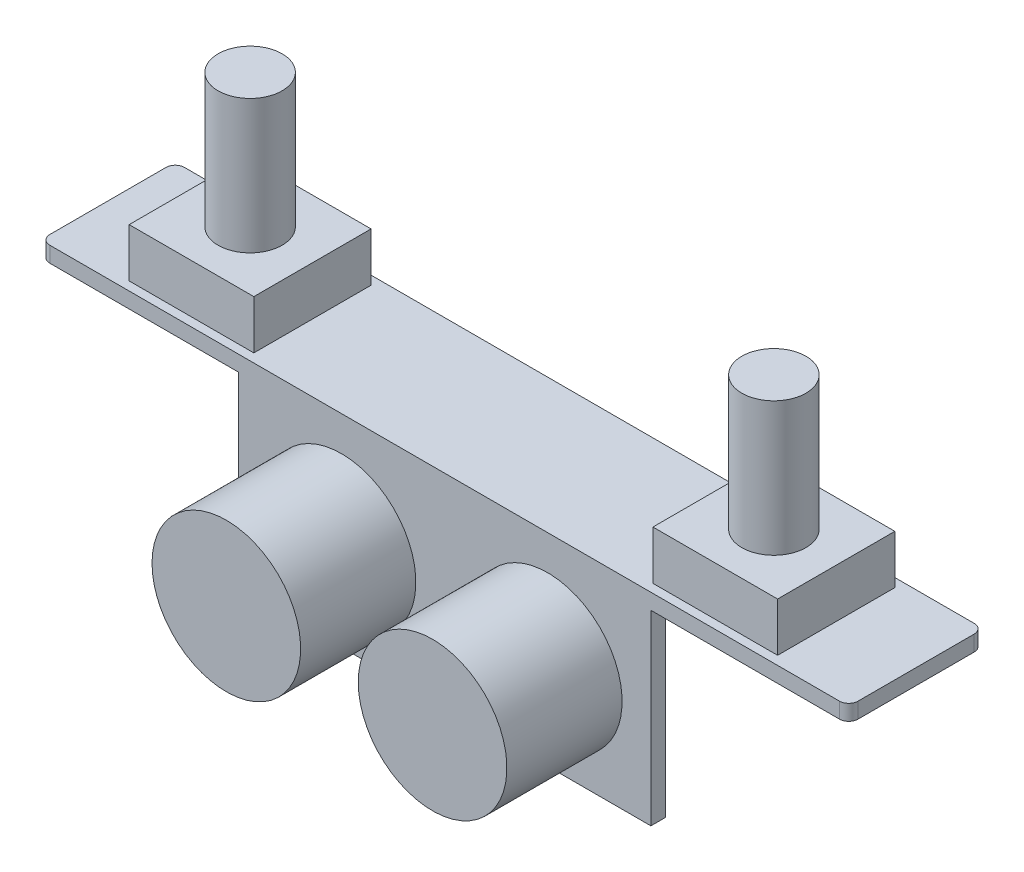
ISO-10303-21;
HEADER;
FILE_DESCRIPTION(('STEP AP214'),'2;1');
FILE_NAME('part.step','',(''),(''),'','','');
FILE_SCHEMA(('AUTOMOTIVE_DESIGN { 1 0 10303 214 1 1 1 1 }'));
ENDSEC;
DATA;
#1=APPLICATION_CONTEXT('core data for automotive mechanical design processes');
#2=APPLICATION_PROTOCOL_DEFINITION('international standard','automotive_design',2000,#1);
#3=PRODUCT_CONTEXT('',#1,'mechanical');
#4=PRODUCT('Part','Part','',(#3));
#5=PRODUCT_RELATED_PRODUCT_CATEGORY('part','',(#4));
#6=PRODUCT_DEFINITION_FORMATION('','',#4);
#7=PRODUCT_DEFINITION_CONTEXT('part definition',#1,'design');
#8=PRODUCT_DEFINITION('design','',#6,#7);
#9=PRODUCT_DEFINITION_SHAPE('','',#8);
#10=(LENGTH_UNIT() NAMED_UNIT(*) SI_UNIT(.MILLI.,.METRE.));
#11=(NAMED_UNIT(*) PLANE_ANGLE_UNIT() SI_UNIT($,.RADIAN.));
#12=(NAMED_UNIT(*) SI_UNIT($,.STERADIAN.) SOLID_ANGLE_UNIT());
#13=UNCERTAINTY_MEASURE_WITH_UNIT(LENGTH_MEASURE(1.E-05),#10,'distance_accuracy_value','');
#14=(GEOMETRIC_REPRESENTATION_CONTEXT(3) GLOBAL_UNCERTAINTY_ASSIGNED_CONTEXT((#13)) GLOBAL_UNIT_ASSIGNED_CONTEXT((#10,
#11,#12)) REPRESENTATION_CONTEXT('',''));
#15=CARTESIAN_POINT('',(0.,0.,0.));
#16=DIRECTION('',(0.,0.,1.));
#17=DIRECTION('',(1.,0.,0.));
#18=AXIS2_PLACEMENT_3D('',#15,#16,#17);
#19=CARTESIAN_POINT('',(42.5,1.68,-6.25));
#20=DIRECTION('',(0.,-1.,0.));
#21=DIRECTION('',(0.,0.,-1.));
#22=AXIS2_PLACEMENT_3D('',#19,#20,#21);
#23=PLANE('',#22);
#24=DIRECTION('',(0.,0.,1.));
#25=VECTOR('',#24,1.);
#26=CARTESIAN_POINT('',(-34.9,1.68,-6.31));
#27=LINE('',#26,#25);
#28=CARTESIAN_POINT('',(-34.9,1.68,-6.31));
#29=VERTEX_POINT('',#28);
#30=CARTESIAN_POINT('',(-34.9,1.68,6.31));
#31=VERTEX_POINT('',#30);
#32=EDGE_CURVE('E284',#29,#31,#27,.T.);
#33=ORIENTED_EDGE('',*,*,#32,.F.);
#34=DIRECTION('',(-1.,0.,0.));
#35=VECTOR('',#34,1.);
#36=CARTESIAN_POINT('',(-34.9,1.68,-6.31));
#37=LINE('',#36,#35);
#38=CARTESIAN_POINT('',(-21.48,1.68,-6.31));
#39=VERTEX_POINT('',#38);
#40=EDGE_CURVE('E290',#39,#29,#37,.T.);
#41=ORIENTED_EDGE('',*,*,#40,.F.);
#42=DIRECTION('',(0.,0.,-1.));
#43=VECTOR('',#42,1.);
#44=CARTESIAN_POINT('',(-21.48,1.68,-6.31));
#45=LINE('',#44,#43);
#46=CARTESIAN_POINT('',(-21.48,1.68,6.31));
#47=VERTEX_POINT('',#46);
#48=EDGE_CURVE('E307',#47,#39,#45,.T.);
#49=ORIENTED_EDGE('',*,*,#48,.F.);
#50=DIRECTION('',(1.,0.,0.));
#51=VECTOR('',#50,1.);
#52=CARTESIAN_POINT('',(-34.9,1.68,6.31));
#53=LINE('',#52,#51);
#54=EDGE_CURVE('E303',#31,#47,#53,.T.);
#55=ORIENTED_EDGE('',*,*,#54,.F.);
#56=EDGE_LOOP('',(#33,#41,#49,#55));
#57=FACE_BOUND('',#56,.T.);
#58=CARTESIAN_POINT('',(42.5,1.68,-6.25));
#59=DIRECTION('',(0.,1.,0.));
#60=DIRECTION('',(0.,0.,-1.));
#61=AXIS2_PLACEMENT_3D('',#58,#59,#60);
#62=CIRCLE('',#61,1.00000000000001);
#63=CARTESIAN_POINT('',(43.5,1.68,-6.25));
#64=VERTEX_POINT('',#63);
#65=CARTESIAN_POINT('',(42.5,1.68,-7.25));
#66=VERTEX_POINT('',#65);
#67=EDGE_CURVE('E330',#64,#66,#62,.T.);
#68=ORIENTED_EDGE('',*,*,#67,.T.);
#69=DIRECTION('',(-1.,0.,0.));
#70=VECTOR('',#69,1.);
#71=CARTESIAN_POINT('',(-42.5,1.68,-7.25));
#72=LINE('',#71,#70);
#73=CARTESIAN_POINT('',(-42.5,1.68,-7.25));
#74=VERTEX_POINT('',#73);
#75=EDGE_CURVE('E334',#66,#74,#72,.T.);
#76=ORIENTED_EDGE('',*,*,#75,.T.);
#77=CARTESIAN_POINT('',(-42.5,1.68,-6.25));
#78=DIRECTION('',(0.,1.,0.));
#79=DIRECTION('',(0.,0.,1.));
#80=AXIS2_PLACEMENT_3D('',#77,#78,#79);
#81=CIRCLE('',#80,1.00000000000001);
#82=CARTESIAN_POINT('',(-43.5,1.68,-6.25));
#83=VERTEX_POINT('',#82);
#84=EDGE_CURVE('E338',#74,#83,#81,.T.);
#85=ORIENTED_EDGE('',*,*,#84,.T.);
#86=DIRECTION('',(0.,0.,1.));
#87=VECTOR('',#86,1.);
#88=CARTESIAN_POINT('',(-43.5,1.68,-6.25));
#89=LINE('',#88,#87);
#90=CARTESIAN_POINT('',(-43.5,1.68,6.25));
#91=VERTEX_POINT('',#90);
#92=EDGE_CURVE('E341',#83,#91,#89,.T.);
#93=ORIENTED_EDGE('',*,*,#92,.T.);
#94=CARTESIAN_POINT('',(-42.5,1.68,6.25));
#95=DIRECTION('',(0.,1.,0.));
#96=DIRECTION('',(0.,0.,1.));
#97=AXIS2_PLACEMENT_3D('',#94,#95,#96);
#98=CIRCLE('',#97,1.00000000000001);
#99=CARTESIAN_POINT('',(-42.5,1.68,7.25000000000001));
#100=VERTEX_POINT('',#99);
#101=EDGE_CURVE('E344',#91,#100,#98,.T.);
#102=ORIENTED_EDGE('',*,*,#101,.T.);
#103=DIRECTION('',(1.,0.,0.));
#104=VECTOR('',#103,1.);
#105=CARTESIAN_POINT('',(-42.5,1.68,7.25));
#106=LINE('',#105,#104);
#107=CARTESIAN_POINT('',(42.5,1.68,7.25));
#108=VERTEX_POINT('',#107);
#109=EDGE_CURVE('E347',#100,#108,#106,.T.);
#110=ORIENTED_EDGE('',*,*,#109,.T.);
#111=CARTESIAN_POINT('',(42.5,1.68,6.25));
#112=DIRECTION('',(0.,1.,0.));
#113=DIRECTION('',(0.,0.,1.));
#114=AXIS2_PLACEMENT_3D('',#111,#112,#113);
#115=CIRCLE('',#114,1.00000000000001);
#116=CARTESIAN_POINT('',(43.5,1.68,6.25));
#117=VERTEX_POINT('',#116);
#118=EDGE_CURVE('E350',#108,#117,#115,.T.);
#119=ORIENTED_EDGE('',*,*,#118,.T.);
#120=DIRECTION('',(0.,0.,-1.));
#121=VECTOR('',#120,1.);
#122=CARTESIAN_POINT('',(43.5,1.68,-6.25));
#123=LINE('',#122,#121);
#124=EDGE_CURVE('E353',#117,#64,#123,.T.);
#125=ORIENTED_EDGE('',*,*,#124,.T.);
#126=EDGE_LOOP('',(#68,#76,#85,#93,#102,#110,#119,#125));
#127=FACE_BOUND('',#126,.T.);
#128=DIRECTION('',(0.,0.,-1.));
#129=VECTOR('',#128,1.);
#130=CARTESIAN_POINT('',(34.9,1.68,-6.31));
#131=LINE('',#130,#129);
#132=CARTESIAN_POINT('',(34.9,1.68,6.31));
#133=VERTEX_POINT('',#132);
#134=CARTESIAN_POINT('',(34.9,1.68,-6.31));
#135=VERTEX_POINT('',#134);
#136=EDGE_CURVE('E238',#133,#135,#131,.T.);
#137=ORIENTED_EDGE('',*,*,#136,.F.);
#138=DIRECTION('',(1.,0.,0.));
#139=VECTOR('',#138,1.);
#140=CARTESIAN_POINT('',(34.9,1.68,6.31));
#141=LINE('',#140,#139);
#142=CARTESIAN_POINT('',(21.48,1.68,6.31));
#143=VERTEX_POINT('',#142);
#144=EDGE_CURVE('E248',#143,#133,#141,.T.);
#145=ORIENTED_EDGE('',*,*,#144,.F.);
#146=DIRECTION('',(0.,0.,1.));
#147=VECTOR('',#146,1.);
#148=CARTESIAN_POINT('',(21.48,1.68,-6.31));
#149=LINE('',#148,#147);
#150=CARTESIAN_POINT('',(21.48,1.68,-6.31));
#151=VERTEX_POINT('',#150);
#152=EDGE_CURVE('E263',#151,#143,#149,.T.);
#153=ORIENTED_EDGE('',*,*,#152,.F.);
#154=DIRECTION('',(-1.,0.,0.));
#155=VECTOR('',#154,1.);
#156=CARTESIAN_POINT('',(34.9,1.68,-6.31));
#157=LINE('',#156,#155);
#158=EDGE_CURVE('E63',#135,#151,#157,.T.);
#159=ORIENTED_EDGE('',*,*,#158,.F.);
#160=EDGE_LOOP('',(#137,#145,#153,#159));
#161=FACE_BOUND('',#160,.T.);
#162=ADVANCED_FACE('F39',(#57,#127,#161),#23,.F.);
#163=CARTESIAN_POINT('',(42.5,1.68,-6.25));
#164=DIRECTION('',(0.,-1.,0.));
#165=DIRECTION('',(0.,0.,-1.));
#166=AXIS2_PLACEMENT_3D('',#163,#164,#165);
#167=CYLINDRICAL_SURFACE('',#166,1.00000000000001);
#168=CARTESIAN_POINT('',(42.5,0.,-6.25));
#169=DIRECTION('',(0.,1.,0.));
#170=DIRECTION('',(0.,0.,-1.));
#171=AXIS2_PLACEMENT_3D('',#168,#169,#170);
#172=CIRCLE('',#171,1.00000000000001);
#173=CARTESIAN_POINT('',(43.5,0.,-6.25));
#174=VERTEX_POINT('',#173);
#175=CARTESIAN_POINT('',(42.5,0.,-7.25));
#176=VERTEX_POINT('',#175);
#177=EDGE_CURVE('E329',#174,#176,#172,.T.);
#178=ORIENTED_EDGE('',*,*,#177,.T.);
#179=DIRECTION('',(0.,-1.,0.));
#180=VECTOR('',#179,1.);
#181=CARTESIAN_POINT('',(42.5,1.68,-7.25));
#182=LINE('',#181,#180);
#183=EDGE_CURVE('E242',#66,#176,#182,.T.);
#184=ORIENTED_EDGE('',*,*,#183,.F.);
#185=ORIENTED_EDGE('',*,*,#67,.F.);
#186=DIRECTION('',(0.,-1.,0.));
#187=VECTOR('',#186,1.);
#188=CARTESIAN_POINT('',(43.5,1.68,-6.25));
#189=LINE('',#188,#187);
#190=EDGE_CURVE('E356',#64,#174,#189,.T.);
#191=ORIENTED_EDGE('',*,*,#190,.T.);
#192=EDGE_LOOP('',(#178,#184,#185,#191));
#193=FACE_BOUND('',#192,.T.);
#194=ADVANCED_FACE('F41',(#193),#167,.T.);
#195=CARTESIAN_POINT('',(-42.5,1.68,-7.25));
#196=DIRECTION('',(0.,0.,1.));
#197=DIRECTION('',(1.,0.,0.));
#198=AXIS2_PLACEMENT_3D('',#195,#196,#197);
#199=PLANE('',#198);
#200=DIRECTION('',(-1.,0.,0.));
#201=VECTOR('',#200,1.);
#202=CARTESIAN_POINT('',(-42.5,0.,-7.25));
#203=LINE('',#202,#201);
#204=CARTESIAN_POINT('',(-42.5,0.,-7.25));
#205=VERTEX_POINT('',#204);
#206=EDGE_CURVE('E360',#176,#205,#203,.T.);
#207=ORIENTED_EDGE('',*,*,#206,.T.);
#208=DIRECTION('',(0.,-1.,0.));
#209=VECTOR('',#208,1.);
#210=CARTESIAN_POINT('',(-42.5,1.68,-7.25));
#211=LINE('',#210,#209);
#212=EDGE_CURVE('E405',#74,#205,#211,.T.);
#213=ORIENTED_EDGE('',*,*,#212,.F.);
#214=ORIENTED_EDGE('',*,*,#75,.F.);
#215=ORIENTED_EDGE('',*,*,#183,.T.);
#216=EDGE_LOOP('',(#207,#213,#214,#215));
#217=FACE_BOUND('',#216,.T.);
#218=ADVANCED_FACE('F465',(#217),#199,.F.);
#219=CARTESIAN_POINT('',(-42.5,1.68,-6.25));
#220=DIRECTION('',(0.,-1.,0.));
#221=DIRECTION('',(0.,0.,-1.));
#222=AXIS2_PLACEMENT_3D('',#219,#220,#221);
#223=CYLINDRICAL_SURFACE('',#222,1.00000000000001);
#224=CARTESIAN_POINT('',(-42.5,0.,-6.25));
#225=DIRECTION('',(0.,1.,0.));
#226=DIRECTION('',(0.,0.,1.));
#227=AXIS2_PLACEMENT_3D('',#224,#225,#226);
#228=CIRCLE('',#227,1.00000000000001);
#229=CARTESIAN_POINT('',(-43.5,0.,-6.25));
#230=VERTEX_POINT('',#229);
#231=EDGE_CURVE('E363',#205,#230,#228,.T.);
#232=ORIENTED_EDGE('',*,*,#231,.T.);
#233=DIRECTION('',(0.,-1.,0.));
#234=VECTOR('',#233,1.);
#235=CARTESIAN_POINT('',(-43.5,1.68,-6.25));
#236=LINE('',#235,#234);
#237=EDGE_CURVE('E401',#83,#230,#236,.T.);
#238=ORIENTED_EDGE('',*,*,#237,.F.);
#239=ORIENTED_EDGE('',*,*,#84,.F.);
#240=ORIENTED_EDGE('',*,*,#212,.T.);
#241=EDGE_LOOP('',(#232,#238,#239,#240));
#242=FACE_BOUND('',#241,.T.);
#243=ADVANCED_FACE('F462',(#242),#223,.T.);
#244=CARTESIAN_POINT('',(-43.5,1.68,-6.25));
#245=DIRECTION('',(1.,0.,0.));
#246=DIRECTION('',(0.,0.,-1.));
#247=AXIS2_PLACEMENT_3D('',#244,#245,#246);
#248=PLANE('',#247);
#249=DIRECTION('',(0.,0.,1.));
#250=VECTOR('',#249,1.);
#251=CARTESIAN_POINT('',(-43.5,0.,-6.25));
#252=LINE('',#251,#250);
#253=CARTESIAN_POINT('',(-43.5,0.,6.25));
#254=VERTEX_POINT('',#253);
#255=EDGE_CURVE('E366',#230,#254,#252,.T.);
#256=ORIENTED_EDGE('',*,*,#255,.T.);
#257=DIRECTION('',(0.,-1.,0.));
#258=VECTOR('',#257,1.);
#259=CARTESIAN_POINT('',(-43.5,1.68,6.25));
#260=LINE('',#259,#258);
#261=EDGE_CURVE('E397',#91,#254,#260,.T.);
#262=ORIENTED_EDGE('',*,*,#261,.F.);
#263=ORIENTED_EDGE('',*,*,#92,.F.);
#264=ORIENTED_EDGE('',*,*,#237,.T.);
#265=EDGE_LOOP('',(#256,#262,#263,#264));
#266=FACE_BOUND('',#265,.T.);
#267=ADVANCED_FACE('F458',(#266),#248,.F.);
#268=CARTESIAN_POINT('',(-42.5,1.68,6.25));
#269=DIRECTION('',(0.,-1.,0.));
#270=DIRECTION('',(0.,0.,-1.));
#271=AXIS2_PLACEMENT_3D('',#268,#269,#270);
#272=CYLINDRICAL_SURFACE('',#271,1.00000000000001);
#273=CARTESIAN_POINT('',(-42.5,0.,6.25));
#274=DIRECTION('',(0.,1.,0.));
#275=DIRECTION('',(0.,0.,1.));
#276=AXIS2_PLACEMENT_3D('',#273,#274,#275);
#277=CIRCLE('',#276,1.00000000000001);
#278=CARTESIAN_POINT('',(-42.5,0.,7.25000000000001));
#279=VERTEX_POINT('',#278);
#280=EDGE_CURVE('E369',#254,#279,#277,.T.);
#281=ORIENTED_EDGE('',*,*,#280,.T.);
#282=DIRECTION('',(0.,-1.,0.));
#283=VECTOR('',#282,1.);
#284=CARTESIAN_POINT('',(-42.5,1.68,7.25000000000001));
#285=LINE('',#284,#283);
#286=EDGE_CURVE('E393',#100,#279,#285,.T.);
#287=ORIENTED_EDGE('',*,*,#286,.F.);
#288=ORIENTED_EDGE('',*,*,#101,.F.);
#289=ORIENTED_EDGE('',*,*,#261,.T.);
#290=EDGE_LOOP('',(#281,#287,#288,#289));
#291=FACE_BOUND('',#290,.T.);
#292=ADVANCED_FACE('F421',(#291),#272,.T.);
#293=CARTESIAN_POINT('',(-42.5,1.68,7.25));
#294=DIRECTION('',(0.,0.,-1.));
#295=DIRECTION('',(-1.,0.,0.));
#296=AXIS2_PLACEMENT_3D('',#293,#294,#295);
#297=PLANE('',#296);
#298=CARTESIAN_POINT('',(-11.1,-10.05,7.25));
#299=DIRECTION('',(0.,0.,-1.));
#300=DIRECTION('',(-1.,0.,0.));
#301=AXIS2_PLACEMENT_3D('',#298,#299,#300);
#302=CIRCLE('',#301,8.);
#303=CARTESIAN_POINT('',(-19.1,-10.05,7.25));
#304=VERTEX_POINT('',#303);
#305=EDGE_CURVE('E11',#304,#304,#302,.F.);
#306=ORIENTED_EDGE('',*,*,#305,.F.);
#307=EDGE_LOOP('',(#306));
#308=FACE_BOUND('',#307,.T.);
#309=CARTESIAN_POINT('',(11.1,-10.05,7.25));
#310=DIRECTION('',(0.,0.,-1.));
#311=DIRECTION('',(-1.,0.,0.));
#312=AXIS2_PLACEMENT_3D('',#309,#310,#311);
#313=CIRCLE('',#312,8.);
#314=CARTESIAN_POINT('',(3.1,-10.05,7.25));
#315=VERTEX_POINT('',#314);
#316=EDGE_CURVE('E48',#315,#315,#313,.F.);
#317=ORIENTED_EDGE('',*,*,#316,.F.);
#318=EDGE_LOOP('',(#317));
#319=FACE_BOUND('',#318,.T.);
#320=DIRECTION('',(1.,0.,0.));
#321=VECTOR('',#320,1.);
#322=CARTESIAN_POINT('',(-42.5,0.,7.25));
#323=LINE('',#322,#321);
#324=CARTESIAN_POINT('',(-22.2,0.,7.25));
#325=VERTEX_POINT('',#324);
#326=EDGE_CURVE('E373',#279,#325,#323,.T.);
#327=ORIENTED_EDGE('',*,*,#326,.T.);
#328=DIRECTION('',(0.,-1.,0.));
#329=VECTOR('',#328,1.);
#330=CARTESIAN_POINT('',(-22.2,0.,7.25));
#331=LINE('',#330,#329);
#332=CARTESIAN_POINT('',(-22.2,-20.1,7.25));
#333=VERTEX_POINT('',#332);
#334=EDGE_CURVE('E55',#325,#333,#331,.T.);
#335=ORIENTED_EDGE('',*,*,#334,.T.);
#336=DIRECTION('',(1.,0.,0.));
#337=VECTOR('',#336,1.);
#338=CARTESIAN_POINT('',(-22.2,-20.1,7.25));
#339=LINE('',#338,#337);
#340=CARTESIAN_POINT('',(22.2,-20.1,7.25));
#341=VERTEX_POINT('',#340);
#342=EDGE_CURVE('E182',#333,#341,#339,.T.);
#343=ORIENTED_EDGE('',*,*,#342,.T.);
#344=DIRECTION('',(0.,1.,0.));
#345=VECTOR('',#344,1.);
#346=CARTESIAN_POINT('',(22.2,0.,7.25));
#347=LINE('',#346,#345);
#348=CARTESIAN_POINT('',(22.2,0.,7.25));
#349=VERTEX_POINT('',#348);
#350=EDGE_CURVE('E201',#341,#349,#347,.T.);
#351=ORIENTED_EDGE('',*,*,#350,.T.);
#352=CARTESIAN_POINT('',(42.5,0.,7.25));
#353=VERTEX_POINT('',#352);
#354=EDGE_CURVE('E372',#349,#353,#323,.T.);
#355=ORIENTED_EDGE('',*,*,#354,.T.);
#356=DIRECTION('',(0.,-1.,0.));
#357=VECTOR('',#356,1.);
#358=CARTESIAN_POINT('',(42.5,1.68,7.25));
#359=LINE('',#358,#357);
#360=EDGE_CURVE('E389',#108,#353,#359,.T.);
#361=ORIENTED_EDGE('',*,*,#360,.F.);
#362=ORIENTED_EDGE('',*,*,#109,.F.);
#363=ORIENTED_EDGE('',*,*,#286,.T.);
#364=EDGE_LOOP('',(#327,#335,#343,#351,#355,#361,#362,#363));
#365=FACE_BOUND('',#364,.T.);
#366=ADVANCED_FACE('F417',(#308,#319,#365),#297,.F.);
#367=CARTESIAN_POINT('',(42.5,1.68,6.25));
#368=DIRECTION('',(0.,-1.,0.));
#369=DIRECTION('',(0.,0.,-1.));
#370=AXIS2_PLACEMENT_3D('',#367,#368,#369);
#371=CYLINDRICAL_SURFACE('',#370,1.00000000000001);
#372=CARTESIAN_POINT('',(42.5,0.,6.25));
#373=DIRECTION('',(0.,1.,0.));
#374=DIRECTION('',(0.,0.,1.));
#375=AXIS2_PLACEMENT_3D('',#372,#373,#374);
#376=CIRCLE('',#375,1.00000000000001);
#377=CARTESIAN_POINT('',(43.5,0.,6.25));
#378=VERTEX_POINT('',#377);
#379=EDGE_CURVE('E377',#353,#378,#376,.T.);
#380=ORIENTED_EDGE('',*,*,#379,.T.);
#381=DIRECTION('',(0.,-1.,0.));
#382=VECTOR('',#381,1.);
#383=CARTESIAN_POINT('',(43.5,1.68,6.25));
#384=LINE('',#383,#382);
#385=EDGE_CURVE('E385',#117,#378,#384,.T.);
#386=ORIENTED_EDGE('',*,*,#385,.F.);
#387=ORIENTED_EDGE('',*,*,#118,.F.);
#388=ORIENTED_EDGE('',*,*,#360,.T.);
#389=EDGE_LOOP('',(#380,#386,#387,#388));
#390=FACE_BOUND('',#389,.T.);
#391=ADVANCED_FACE('F420',(#390),#371,.T.);
#392=CARTESIAN_POINT('',(43.5,1.68,-6.25));
#393=DIRECTION('',(-1.,0.,0.));
#394=DIRECTION('',(0.,0.,1.));
#395=AXIS2_PLACEMENT_3D('',#392,#393,#394);
#396=PLANE('',#395);
#397=DIRECTION('',(0.,0.,-1.));
#398=VECTOR('',#397,1.);
#399=CARTESIAN_POINT('',(43.5,0.,-6.25));
#400=LINE('',#399,#398);
#401=EDGE_CURVE('E335',#378,#174,#400,.T.);
#402=ORIENTED_EDGE('',*,*,#401,.T.);
#403=ORIENTED_EDGE('',*,*,#190,.F.);
#404=ORIENTED_EDGE('',*,*,#124,.F.);
#405=ORIENTED_EDGE('',*,*,#385,.T.);
#406=EDGE_LOOP('',(#402,#403,#404,#405));
#407=FACE_BOUND('',#406,.T.);
#408=ADVANCED_FACE('F446',(#407),#396,.F.);
#409=CARTESIAN_POINT('',(42.5,0.,-6.25));
#410=DIRECTION('',(0.,-1.,0.));
#411=DIRECTION('',(0.,0.,-1.));
#412=AXIS2_PLACEMENT_3D('',#409,#410,#411);
#413=PLANE('',#412);
#414=DIRECTION('',(0.,0.,1.));
#415=VECTOR('',#414,1.);
#416=CARTESIAN_POINT('',(22.2,0.,5.65));
#417=LINE('',#416,#415);
#418=CARTESIAN_POINT('',(22.2,0.,5.65));
#419=VERTEX_POINT('',#418);
#420=EDGE_CURVE('E221',#419,#349,#417,.T.);
#421=ORIENTED_EDGE('',*,*,#420,.F.);
#422=DIRECTION('',(-1.,0.,0.));
#423=VECTOR('',#422,1.);
#424=CARTESIAN_POINT('',(-22.2,0.,5.65));
#425=LINE('',#424,#423);
#426=CARTESIAN_POINT('',(-22.2,0.,5.65));
#427=VERTEX_POINT('',#426);
#428=EDGE_CURVE('E186',#419,#427,#425,.T.);
#429=ORIENTED_EDGE('',*,*,#428,.T.);
#430=DIRECTION('',(0.,0.,1.));
#431=VECTOR('',#430,1.);
#432=CARTESIAN_POINT('',(-22.2,0.,5.65));
#433=LINE('',#432,#431);
#434=EDGE_CURVE('E199',#427,#325,#433,.T.);
#435=ORIENTED_EDGE('',*,*,#434,.T.);
#436=ORIENTED_EDGE('',*,*,#326,.F.);
#437=ORIENTED_EDGE('',*,*,#280,.F.);
#438=ORIENTED_EDGE('',*,*,#255,.F.);
#439=ORIENTED_EDGE('',*,*,#231,.F.);
#440=ORIENTED_EDGE('',*,*,#206,.F.);
#441=ORIENTED_EDGE('',*,*,#177,.F.);
#442=ORIENTED_EDGE('',*,*,#401,.F.);
#443=ORIENTED_EDGE('',*,*,#379,.F.);
#444=ORIENTED_EDGE('',*,*,#354,.F.);
#445=EDGE_LOOP('',(#421,#429,#435,#436,#437,#438,#439,#440,#441,#442,#443,#444));
#446=FACE_BOUND('',#445,.T.);
#447=ADVANCED_FACE('F430',(#446),#413,.T.);
#448=CARTESIAN_POINT('',(-34.9,6.93,-6.31));
#449=DIRECTION('',(1.,0.,0.));
#450=DIRECTION('',(0.,0.,-1.));
#451=AXIS2_PLACEMENT_3D('',#448,#449,#450);
#452=PLANE('',#451);
#453=ORIENTED_EDGE('',*,*,#32,.T.);
#454=DIRECTION('',(0.,-1.,0.));
#455=VECTOR('',#454,1.);
#456=CARTESIAN_POINT('',(-34.9,6.93,6.31));
#457=LINE('',#456,#455);
#458=CARTESIAN_POINT('',(-34.9,6.93,6.31));
#459=VERTEX_POINT('',#458);
#460=EDGE_CURVE('E325',#459,#31,#457,.T.);
#461=ORIENTED_EDGE('',*,*,#460,.F.);
#462=DIRECTION('',(0.,0.,1.));
#463=VECTOR('',#462,1.);
#464=CARTESIAN_POINT('',(-34.9,6.93,-6.31));
#465=LINE('',#464,#463);
#466=CARTESIAN_POINT('',(-34.9,6.93,-6.31));
#467=VERTEX_POINT('',#466);
#468=EDGE_CURVE('E285',#467,#459,#465,.T.);
#469=ORIENTED_EDGE('',*,*,#468,.F.);
#470=DIRECTION('',(0.,-1.,0.));
#471=VECTOR('',#470,1.);
#472=CARTESIAN_POINT('',(-34.9,6.93,-6.31));
#473=LINE('',#472,#471);
#474=EDGE_CURVE('E299',#467,#29,#473,.T.);
#475=ORIENTED_EDGE('',*,*,#474,.T.);
#476=EDGE_LOOP('',(#453,#461,#469,#475));
#477=FACE_BOUND('',#476,.T.);
#478=ADVANCED_FACE('F479',(#477),#452,.F.);
#479=CARTESIAN_POINT('',(-34.9,6.93,6.31));
#480=DIRECTION('',(0.,0.,-1.));
#481=DIRECTION('',(-1.,0.,0.));
#482=AXIS2_PLACEMENT_3D('',#479,#480,#481);
#483=PLANE('',#482);
#484=ORIENTED_EDGE('',*,*,#54,.T.);
#485=DIRECTION('',(0.,-1.,0.));
#486=VECTOR('',#485,1.);
#487=CARTESIAN_POINT('',(-21.48,6.93,6.31));
#488=LINE('',#487,#486);
#489=CARTESIAN_POINT('',(-21.48,6.93,6.31));
#490=VERTEX_POINT('',#489);
#491=EDGE_CURVE('E321',#490,#47,#488,.T.);
#492=ORIENTED_EDGE('',*,*,#491,.F.);
#493=DIRECTION('',(1.,0.,0.));
#494=VECTOR('',#493,1.);
#495=CARTESIAN_POINT('',(-34.9,6.93,6.31));
#496=LINE('',#495,#494);
#497=EDGE_CURVE('E289',#459,#490,#496,.T.);
#498=ORIENTED_EDGE('',*,*,#497,.F.);
#499=ORIENTED_EDGE('',*,*,#460,.T.);
#500=EDGE_LOOP('',(#484,#492,#498,#499));
#501=FACE_BOUND('',#500,.T.);
#502=ADVANCED_FACE('F524',(#501),#483,.F.);
#503=CARTESIAN_POINT('',(-21.48,6.93,-6.31));
#504=DIRECTION('',(-1.,0.,0.));
#505=DIRECTION('',(0.,0.,1.));
#506=AXIS2_PLACEMENT_3D('',#503,#504,#505);
#507=PLANE('',#506);
#508=ORIENTED_EDGE('',*,*,#48,.T.);
#509=DIRECTION('',(0.,-1.,0.));
#510=VECTOR('',#509,1.);
#511=CARTESIAN_POINT('',(-21.48,6.93,-6.31));
#512=LINE('',#511,#510);
#513=CARTESIAN_POINT('',(-21.48,6.93,-6.31));
#514=VERTEX_POINT('',#513);
#515=EDGE_CURVE('E317',#514,#39,#512,.T.);
#516=ORIENTED_EDGE('',*,*,#515,.F.);
#517=DIRECTION('',(0.,0.,-1.));
#518=VECTOR('',#517,1.);
#519=CARTESIAN_POINT('',(-21.48,6.93,-6.31));
#520=LINE('',#519,#518);
#521=EDGE_CURVE('E293',#490,#514,#520,.T.);
#522=ORIENTED_EDGE('',*,*,#521,.F.);
#523=ORIENTED_EDGE('',*,*,#491,.T.);
#524=EDGE_LOOP('',(#508,#516,#522,#523));
#525=FACE_BOUND('',#524,.T.);
#526=ADVANCED_FACE('F531',(#525),#507,.F.);
#527=CARTESIAN_POINT('',(-34.9,6.93,-6.31));
#528=DIRECTION('',(0.,0.,1.));
#529=DIRECTION('',(1.,0.,0.));
#530=AXIS2_PLACEMENT_3D('',#527,#528,#529);
#531=PLANE('',#530);
#532=ORIENTED_EDGE('',*,*,#40,.T.);
#533=ORIENTED_EDGE('',*,*,#474,.F.);
#534=DIRECTION('',(-1.,0.,0.));
#535=VECTOR('',#534,1.);
#536=CARTESIAN_POINT('',(-34.9,6.93,-6.31));
#537=LINE('',#536,#535);
#538=EDGE_CURVE('E296',#514,#467,#537,.T.);
#539=ORIENTED_EDGE('',*,*,#538,.F.);
#540=ORIENTED_EDGE('',*,*,#515,.T.);
#541=EDGE_LOOP('',(#532,#533,#539,#540));
#542=FACE_BOUND('',#541,.T.);
#543=ADVANCED_FACE('F538',(#542),#531,.F.);
#544=CARTESIAN_POINT('',(0.,6.93,0.));
#545=DIRECTION('',(0.,1.,0.));
#546=DIRECTION('',(0.,0.,1.));
#547=AXIS2_PLACEMENT_3D('',#544,#545,#546);
#548=PLANE('',#547);
#549=CARTESIAN_POINT('',(-28.19,6.93,0.));
#550=DIRECTION('',(0.,1.,0.));
#551=DIRECTION('',(0.,0.,1.));
#552=AXIS2_PLACEMENT_3D('',#549,#550,#551);
#553=CIRCLE('',#552,3.45);
#554=CARTESIAN_POINT('',(-28.19,6.93,3.45));
#555=VERTEX_POINT('',#554);
#556=EDGE_CURVE('E234',#555,#555,#553,.T.);
#557=ORIENTED_EDGE('',*,*,#556,.F.);
#558=EDGE_LOOP('',(#557));
#559=FACE_BOUND('',#558,.T.);
#560=ORIENTED_EDGE('',*,*,#468,.T.);
#561=ORIENTED_EDGE('',*,*,#497,.T.);
#562=ORIENTED_EDGE('',*,*,#521,.T.);
#563=ORIENTED_EDGE('',*,*,#538,.T.);
#564=EDGE_LOOP('',(#560,#561,#562,#563));
#565=FACE_BOUND('',#564,.T.);
#566=ADVANCED_FACE('F546',(#559,#565),#548,.T.);
#567=CARTESIAN_POINT('',(34.9,6.93,-6.31));
#568=DIRECTION('',(-1.,0.,0.));
#569=DIRECTION('',(0.,0.,1.));
#570=AXIS2_PLACEMENT_3D('',#567,#568,#569);
#571=PLANE('',#570);
#572=ORIENTED_EDGE('',*,*,#136,.T.);
#573=DIRECTION('',(0.,-1.,0.));
#574=VECTOR('',#573,1.);
#575=CARTESIAN_POINT('',(34.9,6.93,-6.31));
#576=LINE('',#575,#574);
#577=CARTESIAN_POINT('',(34.9,6.93,-6.31));
#578=VERTEX_POINT('',#577);
#579=EDGE_CURVE('E281',#578,#135,#576,.T.);
#580=ORIENTED_EDGE('',*,*,#579,.F.);
#581=DIRECTION('',(0.,0.,-1.));
#582=VECTOR('',#581,1.);
#583=CARTESIAN_POINT('',(34.9,6.93,-6.31));
#584=LINE('',#583,#582);
#585=CARTESIAN_POINT('',(34.9,6.93,6.31));
#586=VERTEX_POINT('',#585);
#587=EDGE_CURVE('E243',#586,#578,#584,.T.);
#588=ORIENTED_EDGE('',*,*,#587,.F.);
#589=DIRECTION('',(0.,-1.,0.));
#590=VECTOR('',#589,1.);
#591=CARTESIAN_POINT('',(34.9,6.93,6.31));
#592=LINE('',#591,#590);
#593=EDGE_CURVE('E257',#586,#133,#592,.T.);
#594=ORIENTED_EDGE('',*,*,#593,.T.);
#595=EDGE_LOOP('',(#572,#580,#588,#594));
#596=FACE_BOUND('',#595,.T.);
#597=ADVANCED_FACE('F555',(#596),#571,.F.);
#598=CARTESIAN_POINT('',(34.9,6.93,-6.31));
#599=DIRECTION('',(0.,0.,1.));
#600=DIRECTION('',(1.,0.,0.));
#601=AXIS2_PLACEMENT_3D('',#598,#599,#600);
#602=PLANE('',#601);
#603=ORIENTED_EDGE('',*,*,#158,.T.);
#604=DIRECTION('',(0.,-1.,0.));
#605=VECTOR('',#604,1.);
#606=CARTESIAN_POINT('',(21.48,6.93,-6.31));
#607=LINE('',#606,#605);
#608=CARTESIAN_POINT('',(21.48,6.93,-6.31));
#609=VERTEX_POINT('',#608);
#610=EDGE_CURVE('E277',#609,#151,#607,.T.);
#611=ORIENTED_EDGE('',*,*,#610,.F.);
#612=DIRECTION('',(-1.,0.,0.));
#613=VECTOR('',#612,1.);
#614=CARTESIAN_POINT('',(34.9,6.93,-6.31));
#615=LINE('',#614,#613);
#616=EDGE_CURVE('E247',#578,#609,#615,.T.);
#617=ORIENTED_EDGE('',*,*,#616,.F.);
#618=ORIENTED_EDGE('',*,*,#579,.T.);
#619=EDGE_LOOP('',(#603,#611,#617,#618));
#620=FACE_BOUND('',#619,.T.);
#621=ADVANCED_FACE('F564',(#620),#602,.F.);
#622=CARTESIAN_POINT('',(21.48,6.93,-6.31));
#623=DIRECTION('',(1.,0.,0.));
#624=DIRECTION('',(0.,0.,-1.));
#625=AXIS2_PLACEMENT_3D('',#622,#623,#624);
#626=PLANE('',#625);
#627=ORIENTED_EDGE('',*,*,#152,.T.);
#628=DIRECTION('',(0.,-1.,0.));
#629=VECTOR('',#628,1.);
#630=CARTESIAN_POINT('',(21.48,6.93,6.31));
#631=LINE('',#630,#629);
#632=CARTESIAN_POINT('',(21.48,6.93,6.31));
#633=VERTEX_POINT('',#632);
#634=EDGE_CURVE('E273',#633,#143,#631,.T.);
#635=ORIENTED_EDGE('',*,*,#634,.F.);
#636=DIRECTION('',(0.,0.,1.));
#637=VECTOR('',#636,1.);
#638=CARTESIAN_POINT('',(21.48,6.93,-6.31));
#639=LINE('',#638,#637);
#640=EDGE_CURVE('E251',#609,#633,#639,.T.);
#641=ORIENTED_EDGE('',*,*,#640,.F.);
#642=ORIENTED_EDGE('',*,*,#610,.T.);
#643=EDGE_LOOP('',(#627,#635,#641,#642));
#644=FACE_BOUND('',#643,.T.);
#645=ADVANCED_FACE('F572',(#644),#626,.F.);
#646=CARTESIAN_POINT('',(34.9,6.93,6.31));
#647=DIRECTION('',(0.,0.,-1.));
#648=DIRECTION('',(-1.,0.,0.));
#649=AXIS2_PLACEMENT_3D('',#646,#647,#648);
#650=PLANE('',#649);
#651=ORIENTED_EDGE('',*,*,#144,.T.);
#652=ORIENTED_EDGE('',*,*,#593,.F.);
#653=DIRECTION('',(1.,0.,0.));
#654=VECTOR('',#653,1.);
#655=CARTESIAN_POINT('',(34.9,6.93,6.31));
#656=LINE('',#655,#654);
#657=EDGE_CURVE('E254',#633,#586,#656,.T.);
#658=ORIENTED_EDGE('',*,*,#657,.F.);
#659=ORIENTED_EDGE('',*,*,#634,.T.);
#660=EDGE_LOOP('',(#651,#652,#658,#659));
#661=FACE_BOUND('',#660,.T.);
#662=ADVANCED_FACE('F580',(#661),#650,.F.);
#663=CARTESIAN_POINT('',(0.,6.93,0.));
#664=DIRECTION('',(0.,-1.,0.));
#665=DIRECTION('',(0.,0.,-1.));
#666=AXIS2_PLACEMENT_3D('',#663,#664,#665);
#667=PLANE('',#666);
#668=CARTESIAN_POINT('',(28.19,6.93,0.));
#669=DIRECTION('',(0.,1.,0.));
#670=DIRECTION('',(0.,0.,-1.));
#671=AXIS2_PLACEMENT_3D('',#668,#669,#670);
#672=CIRCLE('',#671,3.45);
#673=CARTESIAN_POINT('',(28.19,6.93,-3.45));
#674=VERTEX_POINT('',#673);
#675=EDGE_CURVE('E230',#674,#674,#672,.T.);
#676=ORIENTED_EDGE('',*,*,#675,.F.);
#677=EDGE_LOOP('',(#676));
#678=FACE_BOUND('',#677,.T.);
#679=ORIENTED_EDGE('',*,*,#587,.T.);
#680=ORIENTED_EDGE('',*,*,#616,.T.);
#681=ORIENTED_EDGE('',*,*,#640,.T.);
#682=ORIENTED_EDGE('',*,*,#657,.T.);
#683=EDGE_LOOP('',(#679,#680,#681,#682));
#684=FACE_BOUND('',#683,.T.);
#685=ADVANCED_FACE('F587',(#678,#684),#667,.F.);
#686=CARTESIAN_POINT('',(-28.19,21.33,0.));
#687=DIRECTION('',(0.,-1.,0.));
#688=DIRECTION('',(0.,0.,-1.));
#689=AXIS2_PLACEMENT_3D('',#686,#687,#688);
#690=CYLINDRICAL_SURFACE('',#689,3.45);
#691=CARTESIAN_POINT('',(-28.19,21.33,0.));
#692=DIRECTION('',(0.,1.,0.));
#693=DIRECTION('',(0.,0.,1.));
#694=AXIS2_PLACEMENT_3D('',#691,#692,#693);
#695=CIRCLE('',#694,3.45);
#696=CARTESIAN_POINT('',(-28.19,21.33,3.45));
#697=VERTEX_POINT('',#696);
#698=EDGE_CURVE('E229',#697,#697,#695,.T.);
#699=ORIENTED_EDGE('',*,*,#698,.F.);
#700=EDGE_LOOP('',(#699));
#701=FACE_BOUND('',#700,.T.);
#702=ORIENTED_EDGE('',*,*,#556,.T.);
#703=EDGE_LOOP('',(#702));
#704=FACE_BOUND('',#703,.T.);
#705=ADVANCED_FACE('F594',(#701,#704),#690,.T.);
#706=CARTESIAN_POINT('',(-28.19,21.33,0.));
#707=DIRECTION('',(0.,1.,0.));
#708=DIRECTION('',(0.,0.,1.));
#709=AXIS2_PLACEMENT_3D('',#706,#707,#708);
#710=PLANE('',#709);
#711=ORIENTED_EDGE('',*,*,#698,.T.);
#712=EDGE_LOOP('',(#711));
#713=FACE_BOUND('',#712,.T.);
#714=ADVANCED_FACE('F602',(#713),#710,.T.);
#715=CARTESIAN_POINT('',(28.19,21.33,0.));
#716=DIRECTION('',(0.,-1.,0.));
#717=DIRECTION('',(0.,0.,-1.));
#718=AXIS2_PLACEMENT_3D('',#715,#716,#717);
#719=CYLINDRICAL_SURFACE('',#718,3.45);
#720=CARTESIAN_POINT('',(28.19,21.33,0.));
#721=DIRECTION('',(0.,1.,0.));
#722=DIRECTION('',(0.,0.,-1.));
#723=AXIS2_PLACEMENT_3D('',#720,#721,#722);
#724=CIRCLE('',#723,3.45);
#725=CARTESIAN_POINT('',(28.19,21.33,-3.45));
#726=VERTEX_POINT('',#725);
#727=EDGE_CURVE('E220',#726,#726,#724,.T.);
#728=ORIENTED_EDGE('',*,*,#727,.F.);
#729=EDGE_LOOP('',(#728));
#730=FACE_BOUND('',#729,.T.);
#731=ORIENTED_EDGE('',*,*,#675,.T.);
#732=EDGE_LOOP('',(#731));
#733=FACE_BOUND('',#732,.T.);
#734=ADVANCED_FACE('F610',(#730,#733),#719,.T.);
#735=CARTESIAN_POINT('',(28.19,21.33,0.));
#736=DIRECTION('',(0.,-1.,0.));
#737=DIRECTION('',(0.,0.,-1.));
#738=AXIS2_PLACEMENT_3D('',#735,#736,#737);
#739=PLANE('',#738);
#740=ORIENTED_EDGE('',*,*,#727,.T.);
#741=EDGE_LOOP('',(#740));
#742=FACE_BOUND('',#741,.T.);
#743=ADVANCED_FACE('F618',(#742),#739,.F.);
#744=CARTESIAN_POINT('',(-22.2,0.,5.65));
#745=DIRECTION('',(-1.,0.,0.));
#746=DIRECTION('',(0.,-1.,0.));
#747=AXIS2_PLACEMENT_3D('',#744,#745,#746);
#748=PLANE('',#747);
#749=ORIENTED_EDGE('',*,*,#334,.F.);
#750=ORIENTED_EDGE('',*,*,#434,.F.);
#751=DIRECTION('',(0.,-1.,0.));
#752=VECTOR('',#751,1.);
#753=CARTESIAN_POINT('',(-22.2,0.,5.65));
#754=LINE('',#753,#752);
#755=CARTESIAN_POINT('',(-22.2,-20.1,5.65));
#756=VERTEX_POINT('',#755);
#757=EDGE_CURVE('E193',#427,#756,#754,.T.);
#758=ORIENTED_EDGE('',*,*,#757,.T.);
#759=DIRECTION('',(0.,0.,1.));
#760=VECTOR('',#759,1.);
#761=CARTESIAN_POINT('',(-22.2,-20.1,5.65));
#762=LINE('',#761,#760);
#763=EDGE_CURVE('E177',#756,#333,#762,.T.);
#764=ORIENTED_EDGE('',*,*,#763,.T.);
#765=EDGE_LOOP('',(#749,#750,#758,#764));
#766=FACE_BOUND('',#765,.T.);
#767=ADVANCED_FACE('F198',(#766),#748,.T.);
#768=CARTESIAN_POINT('',(22.2,0.,5.65));
#769=DIRECTION('',(1.,0.,0.));
#770=DIRECTION('',(0.,1.,0.));
#771=AXIS2_PLACEMENT_3D('',#768,#769,#770);
#772=PLANE('',#771);
#773=ORIENTED_EDGE('',*,*,#350,.F.);
#774=DIRECTION('',(0.,0.,1.));
#775=VECTOR('',#774,1.);
#776=CARTESIAN_POINT('',(22.2,-20.1,5.65));
#777=LINE('',#776,#775);
#778=CARTESIAN_POINT('',(22.2,-20.1,5.65));
#779=VERTEX_POINT('',#778);
#780=EDGE_CURVE('E185',#779,#341,#777,.T.);
#781=ORIENTED_EDGE('',*,*,#780,.F.);
#782=DIRECTION('',(0.,1.,0.));
#783=VECTOR('',#782,1.);
#784=CARTESIAN_POINT('',(22.2,0.,5.65));
#785=LINE('',#784,#783);
#786=EDGE_CURVE('E195',#779,#419,#785,.T.);
#787=ORIENTED_EDGE('',*,*,#786,.T.);
#788=ORIENTED_EDGE('',*,*,#420,.T.);
#789=EDGE_LOOP('',(#773,#781,#787,#788));
#790=FACE_BOUND('',#789,.T.);
#791=ADVANCED_FACE('F436',(#790),#772,.T.);
#792=CARTESIAN_POINT('',(-22.2,-20.1,5.65));
#793=DIRECTION('',(0.,-1.,0.));
#794=DIRECTION('',(0.,0.,-1.));
#795=AXIS2_PLACEMENT_3D('',#792,#793,#794);
#796=PLANE('',#795);
#797=ORIENTED_EDGE('',*,*,#342,.F.);
#798=ORIENTED_EDGE('',*,*,#763,.F.);
#799=DIRECTION('',(1.,0.,0.));
#800=VECTOR('',#799,1.);
#801=CARTESIAN_POINT('',(-22.2,-20.1,5.65));
#802=LINE('',#801,#800);
#803=EDGE_CURVE('E180',#756,#779,#802,.T.);
#804=ORIENTED_EDGE('',*,*,#803,.T.);
#805=ORIENTED_EDGE('',*,*,#780,.T.);
#806=EDGE_LOOP('',(#797,#798,#804,#805));
#807=FACE_BOUND('',#806,.T.);
#808=ADVANCED_FACE('F179',(#807),#796,.T.);
#809=CARTESIAN_POINT('',(0.,0.,5.65));
#810=DIRECTION('',(0.,0.,1.));
#811=DIRECTION('',(1.,0.,0.));
#812=AXIS2_PLACEMENT_3D('',#809,#810,#811);
#813=PLANE('',#812);
#814=ORIENTED_EDGE('',*,*,#757,.F.);
#815=ORIENTED_EDGE('',*,*,#428,.F.);
#816=ORIENTED_EDGE('',*,*,#786,.F.);
#817=ORIENTED_EDGE('',*,*,#803,.F.);
#818=EDGE_LOOP('',(#814,#815,#816,#817));
#819=FACE_BOUND('',#818,.T.);
#820=ADVANCED_FACE('F191',(#819),#813,.F.);
#821=CARTESIAN_POINT('',(11.1,-10.05,19.65));
#822=DIRECTION('',(0.,0.,-1.));
#823=DIRECTION('',(-1.,0.,0.));
#824=AXIS2_PLACEMENT_3D('',#821,#822,#823);
#825=CYLINDRICAL_SURFACE('',#824,8.);
#826=CARTESIAN_POINT('',(11.1,-10.05,19.65));
#827=DIRECTION('',(0.,0.,1.));
#828=DIRECTION('',(1.,0.,0.));
#829=AXIS2_PLACEMENT_3D('',#826,#827,#828);
#830=CIRCLE('',#829,8.);
#831=CARTESIAN_POINT('',(3.1,-10.05,19.65));
#832=VERTEX_POINT('',#831);
#833=EDGE_CURVE('E207',#832,#832,#830,.T.);
#834=CARTESIAN_POINT('',(3.1,-10.05,19.65));
#835=CARTESIAN_POINT('',(3.1,-10.05,19.5208333333333));
#836=CARTESIAN_POINT('',(3.1,-10.05,19.3916666666667));
#837=CARTESIAN_POINT('',(3.1,-10.05,19.1333333333333));
#838=CARTESIAN_POINT('',(3.1,-10.05,19.0041666666667));
#839=CARTESIAN_POINT('',(3.1,-10.05,18.7458333333333));
#840=CARTESIAN_POINT('',(3.1,-10.05,18.6166666666667));
#841=CARTESIAN_POINT('',(3.1,-10.05,18.3583333333333));
#842=CARTESIAN_POINT('',(3.1,-10.05,18.2291666666667));
#843=CARTESIAN_POINT('',(3.1,-10.05,17.9708333333333));
#844=CARTESIAN_POINT('',(3.1,-10.05,17.8416666666667));
#845=CARTESIAN_POINT('',(3.1,-10.05,17.5833333333333));
#846=CARTESIAN_POINT('',(3.1,-10.05,17.4541666666667));
#847=CARTESIAN_POINT('',(3.1,-10.05,17.1958333333333));
#848=CARTESIAN_POINT('',(3.1,-10.05,17.0666666666667));
#849=CARTESIAN_POINT('',(3.1,-10.05,16.8083333333333));
#850=CARTESIAN_POINT('',(3.1,-10.05,16.6791666666667));
#851=CARTESIAN_POINT('',(3.1,-10.05,16.4208333333333));
#852=CARTESIAN_POINT('',(3.1,-10.05,16.2916666666667));
#853=CARTESIAN_POINT('',(3.1,-10.05,16.0333333333333));
#854=CARTESIAN_POINT('',(3.1,-10.05,15.9041666666667));
#855=CARTESIAN_POINT('',(3.1,-10.05,15.6458333333333));
#856=CARTESIAN_POINT('',(3.1,-10.05,15.5166666666667));
#857=CARTESIAN_POINT('',(3.1,-10.05,15.2583333333333));
#858=CARTESIAN_POINT('',(3.1,-10.05,15.1291666666667));
#859=CARTESIAN_POINT('',(3.1,-10.05,14.8708333333333));
#860=CARTESIAN_POINT('',(3.1,-10.05,14.7416666666667));
#861=CARTESIAN_POINT('',(3.1,-10.05,14.4833333333333));
#862=CARTESIAN_POINT('',(3.1,-10.05,14.3541666666667));
#863=CARTESIAN_POINT('',(3.1,-10.05,14.0958333333333));
#864=CARTESIAN_POINT('',(3.1,-10.05,13.9666666666667));
#865=CARTESIAN_POINT('',(3.1,-10.05,13.7083333333333));
#866=CARTESIAN_POINT('',(3.1,-10.05,13.5791666666667));
#867=CARTESIAN_POINT('',(3.1,-10.05,13.3208333333333));
#868=CARTESIAN_POINT('',(3.1,-10.05,13.1916666666667));
#869=CARTESIAN_POINT('',(3.1,-10.05,12.9333333333333));
#870=CARTESIAN_POINT('',(3.1,-10.05,12.8041666666667));
#871=CARTESIAN_POINT('',(3.1,-10.05,12.5458333333333));
#872=CARTESIAN_POINT('',(3.1,-10.05,12.4166666666667));
#873=CARTESIAN_POINT('',(3.1,-10.05,12.1583333333333));
#874=CARTESIAN_POINT('',(3.1,-10.05,12.0291666666667));
#875=CARTESIAN_POINT('',(3.1,-10.05,11.7708333333333));
#876=CARTESIAN_POINT('',(3.1,-10.05,11.6416666666667));
#877=CARTESIAN_POINT('',(3.1,-10.05,11.3833333333333));
#878=CARTESIAN_POINT('',(3.1,-10.05,11.2541666666667));
#879=CARTESIAN_POINT('',(3.1,-10.05,10.9958333333333));
#880=CARTESIAN_POINT('',(3.1,-10.05,10.8666666666667));
#881=CARTESIAN_POINT('',(3.1,-10.05,10.6083333333333));
#882=CARTESIAN_POINT('',(3.1,-10.05,10.4791666666667));
#883=CARTESIAN_POINT('',(3.1,-10.05,10.2208333333333));
#884=CARTESIAN_POINT('',(3.1,-10.05,10.0916666666667));
#885=CARTESIAN_POINT('',(3.1,-10.05,9.83333333333333));
#886=CARTESIAN_POINT('',(3.1,-10.05,9.70416666666667));
#887=CARTESIAN_POINT('',(3.1,-10.05,9.44583333333333));
#888=CARTESIAN_POINT('',(3.1,-10.05,9.31666666666667));
#889=CARTESIAN_POINT('',(3.1,-10.05,9.05833333333334));
#890=CARTESIAN_POINT('',(3.1,-10.05,8.92916666666667));
#891=CARTESIAN_POINT('',(3.1,-10.05,8.67083333333333));
#892=CARTESIAN_POINT('',(3.1,-10.05,8.54166666666667));
#893=CARTESIAN_POINT('',(3.1,-10.05,8.28333333333333));
#894=CARTESIAN_POINT('',(3.1,-10.05,8.15416666666667));
#895=CARTESIAN_POINT('',(3.1,-10.05,7.89583333333333));
#896=CARTESIAN_POINT('',(3.1,-10.05,7.76666666666667));
#897=CARTESIAN_POINT('',(3.1,-10.05,7.50833333333333));
#898=CARTESIAN_POINT('',(3.1,-10.05,7.37916666666667));
#899=CARTESIAN_POINT('',(3.1,-10.05,7.25));
#900=B_SPLINE_CURVE_WITH_KNOTS('',3,(#834,#835,#836,#837,#838,#839,#840,#841,#842,#843,#844,
#845,#846,#847,#848,#849,#850,#851,#852,#853,#854,#855,#856,#857,#858,#859,#860,#861,#862,#863,
#864,#865,#866,#867,#868,#869,#870,#871,#872,#873,#874,#875,#876,#877,#878,#879,#880,#881,#882,
#883,#884,#885,#886,#887,#888,#889,#890,#891,#892,#893,#894,#895,#896,#897,#898,#899),
.UNSPECIFIED.,.F.,.F.,(4,2,2,2,2,2,2,2,2,2,2,2,2,2,2,2,2,2,2,2,2,2,2,2,2,2,2,2,2,2,2,2,4),(0.,
0.387500000000002,0.775000000000001,1.1625,1.55,1.9375,2.325,2.7125,3.1,3.4875,3.875,4.2625,
4.65,5.0375,5.425,5.8125,6.2,6.5875,6.975,7.3625,7.75,8.1375,8.525,8.9125,9.3,9.6875,10.075,
10.4625,10.85,11.2375,11.625,12.0125,12.4),.UNSPECIFIED.);
#901=EDGE_CURVE('BSEAM415',#832,#315,#900,.T.);
#902=ORIENTED_EDGE('',*,*,#833,.F.);
#903=ORIENTED_EDGE('',*,*,#316,.T.);
#904=ORIENTED_EDGE('',*,*,#901,.T.);
#905=ORIENTED_EDGE('',*,*,#901,.F.);
#906=EDGE_LOOP('',(#902,#904,#903,#905));
#907=FACE_BOUND('',#906,.T.);
#908=ADVANCED_FACE('F415',(#907),#825,.T.);
#909=CARTESIAN_POINT('',(11.1,-10.05,19.65));
#910=DIRECTION('',(0.,0.,1.));
#911=DIRECTION('',(1.,0.,0.));
#912=AXIS2_PLACEMENT_3D('',#909,#910,#911);
#913=PLANE('',#912);
#914=ORIENTED_EDGE('',*,*,#833,.T.);
#915=EDGE_LOOP('',(#914));
#916=FACE_BOUND('',#915,.T.);
#917=ADVANCED_FACE('F653',(#916),#913,.T.);
#918=CARTESIAN_POINT('',(-11.1,-10.05,19.65));
#919=DIRECTION('',(0.,0.,-1.));
#920=DIRECTION('',(-1.,0.,0.));
#921=AXIS2_PLACEMENT_3D('',#918,#919,#920);
#922=CYLINDRICAL_SURFACE('',#921,8.);
#923=CARTESIAN_POINT('',(-11.1,-10.05,19.65));
#924=DIRECTION('',(0.,0.,1.));
#925=DIRECTION('',(-1.,0.,0.));
#926=AXIS2_PLACEMENT_3D('',#923,#924,#925);
#927=CIRCLE('',#926,8.);
#928=CARTESIAN_POINT('',(-19.1,-10.05,19.65));
#929=VERTEX_POINT('',#928);
#930=EDGE_CURVE('E759',#929,#929,#927,.T.);
#931=CARTESIAN_POINT('',(-19.1,-10.05,19.65));
#932=CARTESIAN_POINT('',(-19.1,-10.05,19.5208333333333));
#933=CARTESIAN_POINT('',(-19.1,-10.05,19.3916666666667));
#934=CARTESIAN_POINT('',(-19.1,-10.05,19.1333333333333));
#935=CARTESIAN_POINT('',(-19.1,-10.05,19.0041666666667));
#936=CARTESIAN_POINT('',(-19.1,-10.05,18.7458333333333));
#937=CARTESIAN_POINT('',(-19.1,-10.05,18.6166666666667));
#938=CARTESIAN_POINT('',(-19.1,-10.05,18.3583333333333));
#939=CARTESIAN_POINT('',(-19.1,-10.05,18.2291666666667));
#940=CARTESIAN_POINT('',(-19.1,-10.05,17.9708333333333));
#941=CARTESIAN_POINT('',(-19.1,-10.05,17.8416666666667));
#942=CARTESIAN_POINT('',(-19.1,-10.05,17.5833333333333));
#943=CARTESIAN_POINT('',(-19.1,-10.05,17.4541666666667));
#944=CARTESIAN_POINT('',(-19.1,-10.05,17.1958333333333));
#945=CARTESIAN_POINT('',(-19.1,-10.05,17.0666666666667));
#946=CARTESIAN_POINT('',(-19.1,-10.05,16.8083333333333));
#947=CARTESIAN_POINT('',(-19.1,-10.05,16.6791666666667));
#948=CARTESIAN_POINT('',(-19.1,-10.05,16.4208333333333));
#949=CARTESIAN_POINT('',(-19.1,-10.05,16.2916666666667));
#950=CARTESIAN_POINT('',(-19.1,-10.05,16.0333333333333));
#951=CARTESIAN_POINT('',(-19.1,-10.05,15.9041666666667));
#952=CARTESIAN_POINT('',(-19.1,-10.05,15.6458333333333));
#953=CARTESIAN_POINT('',(-19.1,-10.05,15.5166666666667));
#954=CARTESIAN_POINT('',(-19.1,-10.05,15.2583333333333));
#955=CARTESIAN_POINT('',(-19.1,-10.05,15.1291666666667));
#956=CARTESIAN_POINT('',(-19.1,-10.05,14.8708333333333));
#957=CARTESIAN_POINT('',(-19.1,-10.05,14.7416666666667));
#958=CARTESIAN_POINT('',(-19.1,-10.05,14.4833333333333));
#959=CARTESIAN_POINT('',(-19.1,-10.05,14.3541666666667));
#960=CARTESIAN_POINT('',(-19.1,-10.05,14.0958333333333));
#961=CARTESIAN_POINT('',(-19.1,-10.05,13.9666666666667));
#962=CARTESIAN_POINT('',(-19.1,-10.05,13.7083333333333));
#963=CARTESIAN_POINT('',(-19.1,-10.05,13.5791666666667));
#964=CARTESIAN_POINT('',(-19.1,-10.05,13.3208333333333));
#965=CARTESIAN_POINT('',(-19.1,-10.05,13.1916666666667));
#966=CARTESIAN_POINT('',(-19.1,-10.05,12.9333333333333));
#967=CARTESIAN_POINT('',(-19.1,-10.05,12.8041666666667));
#968=CARTESIAN_POINT('',(-19.1,-10.05,12.5458333333333));
#969=CARTESIAN_POINT('',(-19.1,-10.05,12.4166666666667));
#970=CARTESIAN_POINT('',(-19.1,-10.05,12.1583333333333));
#971=CARTESIAN_POINT('',(-19.1,-10.05,12.0291666666667));
#972=CARTESIAN_POINT('',(-19.1,-10.05,11.7708333333333));
#973=CARTESIAN_POINT('',(-19.1,-10.05,11.6416666666667));
#974=CARTESIAN_POINT('',(-19.1,-10.05,11.3833333333333));
#975=CARTESIAN_POINT('',(-19.1,-10.05,11.2541666666667));
#976=CARTESIAN_POINT('',(-19.1,-10.05,10.9958333333333));
#977=CARTESIAN_POINT('',(-19.1,-10.05,10.8666666666667));
#978=CARTESIAN_POINT('',(-19.1,-10.05,10.6083333333333));
#979=CARTESIAN_POINT('',(-19.1,-10.05,10.4791666666667));
#980=CARTESIAN_POINT('',(-19.1,-10.05,10.2208333333333));
#981=CARTESIAN_POINT('',(-19.1,-10.05,10.0916666666667));
#982=CARTESIAN_POINT('',(-19.1,-10.05,9.83333333333333));
#983=CARTESIAN_POINT('',(-19.1,-10.05,9.70416666666667));
#984=CARTESIAN_POINT('',(-19.1,-10.05,9.44583333333333));
#985=CARTESIAN_POINT('',(-19.1,-10.05,9.31666666666667));
#986=CARTESIAN_POINT('',(-19.1,-10.05,9.05833333333334));
#987=CARTESIAN_POINT('',(-19.1,-10.05,8.92916666666667));
#988=CARTESIAN_POINT('',(-19.1,-10.05,8.67083333333333));
#989=CARTESIAN_POINT('',(-19.1,-10.05,8.54166666666667));
#990=CARTESIAN_POINT('',(-19.1,-10.05,8.28333333333333));
#991=CARTESIAN_POINT('',(-19.1,-10.05,8.15416666666667));
#992=CARTESIAN_POINT('',(-19.1,-10.05,7.89583333333333));
#993=CARTESIAN_POINT('',(-19.1,-10.05,7.76666666666667));
#994=CARTESIAN_POINT('',(-19.1,-10.05,7.50833333333333));
#995=CARTESIAN_POINT('',(-19.1,-10.05,7.37916666666667));
#996=CARTESIAN_POINT('',(-19.1,-10.05,7.25));
#997=B_SPLINE_CURVE_WITH_KNOTS('',3,(#931,#932,#933,#934,#935,#936,#937,#938,#939,#940,#941,
#942,#943,#944,#945,#946,#947,#948,#949,#950,#951,#952,#953,#954,#955,#956,#957,#958,#959,#960,
#961,#962,#963,#964,#965,#966,#967,#968,#969,#970,#971,#972,#973,#974,#975,#976,#977,#978,#979,
#980,#981,#982,#983,#984,#985,#986,#987,#988,#989,#990,#991,#992,#993,#994,#995,#996),
.UNSPECIFIED.,.F.,.F.,(4,2,2,2,2,2,2,2,2,2,2,2,2,2,2,2,2,2,2,2,2,2,2,2,2,2,2,2,2,2,2,2,4),(0.,
0.387500000000002,0.775000000000001,1.1625,1.55,1.9375,2.325,2.7125,3.1,3.4875,3.875,4.2625,
4.65,5.0375,5.425,5.8125,6.2,6.5875,6.975,7.3625,7.75,8.1375,8.525,8.9125,9.3,9.6875,10.075,
10.4625,10.85,11.2375,11.625,12.0125,12.4),.UNSPECIFIED.);
#998=EDGE_CURVE('BSEAM661',#929,#304,#997,.T.);
#999=ORIENTED_EDGE('',*,*,#930,.F.);
#1000=ORIENTED_EDGE('',*,*,#305,.T.);
#1001=ORIENTED_EDGE('',*,*,#998,.T.);
#1002=ORIENTED_EDGE('',*,*,#998,.F.);
#1003=EDGE_LOOP('',(#999,#1001,#1000,#1002));
#1004=FACE_BOUND('',#1003,.T.);
#1005=ADVANCED_FACE('F661',(#1004),#922,.T.);
#1006=CARTESIAN_POINT('',(-11.1,-10.05,19.65));
#1007=DIRECTION('',(0.,0.,-1.));
#1008=DIRECTION('',(-1.,0.,0.));
#1009=AXIS2_PLACEMENT_3D('',#1006,#1007,#1008);
#1010=PLANE('',#1009);
#1011=ORIENTED_EDGE('',*,*,#930,.T.);
#1012=EDGE_LOOP('',(#1011));
#1013=FACE_BOUND('',#1012,.T.);
#1014=ADVANCED_FACE('F669',(#1013),#1010,.F.);
#1015=CLOSED_SHELL('',(#162,#194,#218,#243,#267,#292,#366,#391,#408,#447,#478,#502,#526,#543,
#566,#597,#621,#645,#662,#685,#705,#714,#734,#743,#767,#791,#808,#820,#908,#917,#1005,#1014));
#1016=MANIFOLD_SOLID_BREP('B2',#1015);
#1017=ADVANCED_BREP_SHAPE_REPRESENTATION('',(#18,#1016),#14);
#1018=SHAPE_DEFINITION_REPRESENTATION(#9,#1017);
ENDSEC;
END-ISO-10303-21;
